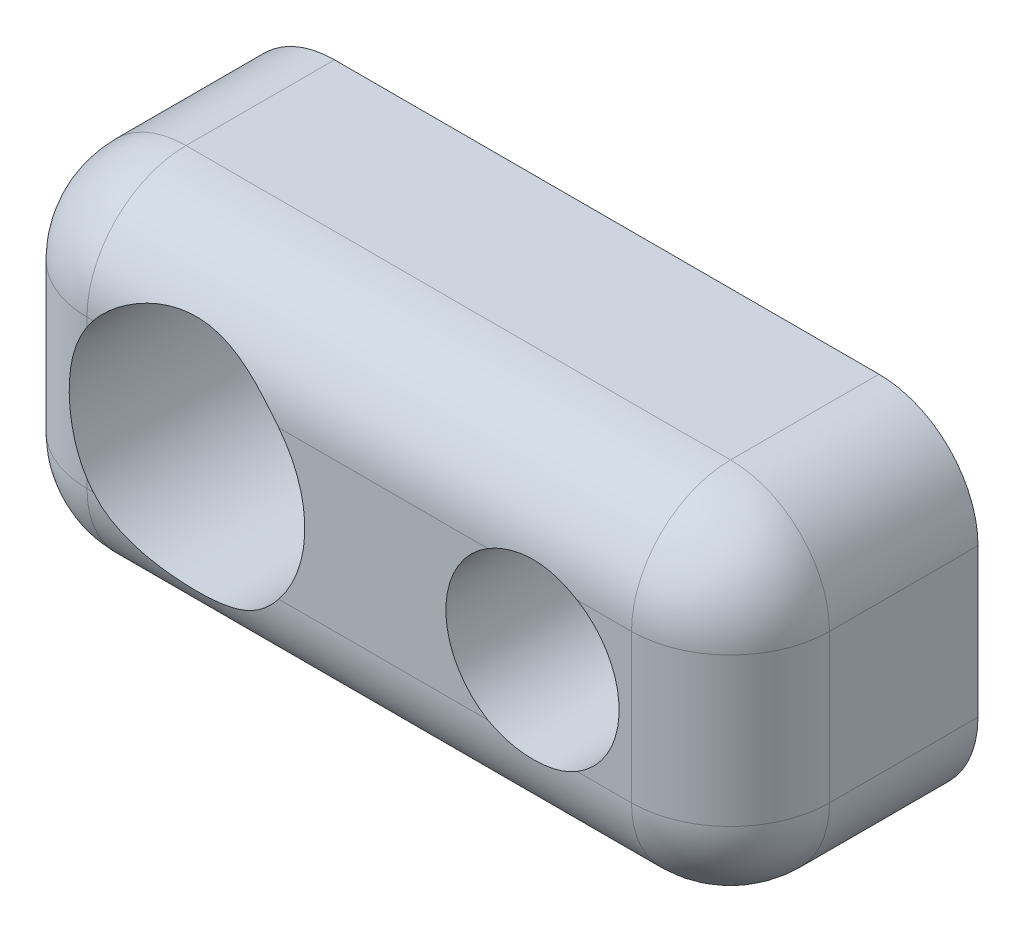
ISO-10303-21;
HEADER;
FILE_DESCRIPTION(('STEP AP214'),'2;1');
FILE_NAME('part.step','',(''),(''),'','','');
FILE_SCHEMA(('AUTOMOTIVE_DESIGN { 1 0 10303 214 1 1 1 1 }'));
ENDSEC;
DATA;
#1=APPLICATION_CONTEXT('core data for automotive mechanical design processes');
#2=APPLICATION_PROTOCOL_DEFINITION('international standard','automotive_design',2000,#1);
#3=PRODUCT_CONTEXT('',#1,'mechanical');
#4=PRODUCT('Part','Part','',(#3));
#5=PRODUCT_RELATED_PRODUCT_CATEGORY('part','',(#4));
#6=PRODUCT_DEFINITION_FORMATION('','',#4);
#7=PRODUCT_DEFINITION_CONTEXT('part definition',#1,'design');
#8=PRODUCT_DEFINITION('design','',#6,#7);
#9=PRODUCT_DEFINITION_SHAPE('','',#8);
#10=(LENGTH_UNIT() NAMED_UNIT(*) SI_UNIT(.MILLI.,.METRE.));
#11=(NAMED_UNIT(*) PLANE_ANGLE_UNIT() SI_UNIT($,.RADIAN.));
#12=(NAMED_UNIT(*) SI_UNIT($,.STERADIAN.) SOLID_ANGLE_UNIT());
#13=UNCERTAINTY_MEASURE_WITH_UNIT(LENGTH_MEASURE(1.E-05),#10,'distance_accuracy_value','');
#14=(GEOMETRIC_REPRESENTATION_CONTEXT(3) GLOBAL_UNCERTAINTY_ASSIGNED_CONTEXT((#13)) GLOBAL_UNIT_ASSIGNED_CONTEXT((#10,
#11,#12)) REPRESENTATION_CONTEXT('',''));
#15=CARTESIAN_POINT('',(0.,0.,0.));
#16=DIRECTION('',(0.,0.,1.));
#17=DIRECTION('',(1.,0.,0.));
#18=AXIS2_PLACEMENT_3D('',#15,#16,#17);
#19=CARTESIAN_POINT('',(5.5,1.5,5.));
#20=DIRECTION('',(0.,0.,-1.));
#21=DIRECTION('',(-1.,0.,0.));
#22=AXIS2_PLACEMENT_3D('',#19,#20,#21);
#23=PLANE('',#22);
#24=CARTESIAN_POINT('',(-3.5,0.,5.));
#25=DIRECTION('',(0.,0.,1.));
#26=DIRECTION('',(1.,0.,0.));
#27=AXIS2_PLACEMENT_3D('',#24,#25,#26);
#28=CIRCLE('',#27,2.4);
#29=CARTESIAN_POINT('',(-1.62650060048048,-1.5,5.));
#30=VERTEX_POINT('',#29);
#31=CARTESIAN_POINT('',(-1.62650060048048,1.5,5.));
#32=VERTEX_POINT('',#31);
#33=EDGE_CURVE('E177',#30,#32,#28,.T.);
#34=ORIENTED_EDGE('',*,*,#33,.F.);
#35=DIRECTION('',(1.,0.,0.));
#36=VECTOR('',#35,1.);
#37=CARTESIAN_POINT('',(5.5,-1.5,5.));
#38=LINE('',#37,#36);
#39=CARTESIAN_POINT('',(2.59861218113401,-1.5,5.));
#40=VERTEX_POINT('',#39);
#41=EDGE_CURVE('E226',#30,#40,#38,.T.);
#42=ORIENTED_EDGE('',*,*,#41,.T.);
#43=CARTESIAN_POINT('',(3.5,0.,5.));
#44=DIRECTION('',(0.,0.,1.));
#45=DIRECTION('',(1.,0.,0.));
#46=AXIS2_PLACEMENT_3D('',#43,#44,#45);
#47=CIRCLE('',#46,1.75);
#48=CARTESIAN_POINT('',(2.598612181134,1.5,5.));
#49=VERTEX_POINT('',#48);
#50=EDGE_CURVE('E358',#49,#40,#47,.T.);
#51=ORIENTED_EDGE('',*,*,#50,.F.);
#52=DIRECTION('',(-1.,0.,0.));
#53=VECTOR('',#52,1.);
#54=CARTESIAN_POINT('',(5.5,1.5,5.));
#55=LINE('',#54,#53);
#56=EDGE_CURVE('E213',#49,#32,#55,.T.);
#57=ORIENTED_EDGE('',*,*,#56,.T.);
#58=EDGE_LOOP('',(#34,#42,#51,#57));
#59=FACE_BOUND('',#58,.T.);
#60=ADVANCED_FACE('F37',(#59),#23,.F.);
#61=DIRECTION('',(0.,-1.,0.));
#62=VECTOR('',#61,1.);
#63=CARTESIAN_POINT('',(-5.5,1.5,5.));
#64=LINE('',#63,#62);
#65=CARTESIAN_POINT('',(-5.5,-1.32664991614216,5.));
#66=VERTEX_POINT('',#65);
#67=CARTESIAN_POINT('',(-5.5,-1.5,5.));
#68=VERTEX_POINT('',#67);
#69=EDGE_CURVE('E222',#66,#68,#64,.T.);
#70=ORIENTED_EDGE('',*,*,#69,.T.);
#71=DIRECTION('',(1.,0.,0.));
#72=VECTOR('',#71,1.);
#73=CARTESIAN_POINT('',(5.5,-1.5,5.));
#74=LINE('',#73,#72);
#75=CARTESIAN_POINT('',(-5.37349939951952,-1.5,5.));
#76=VERTEX_POINT('',#75);
#77=EDGE_CURVE('E224',#68,#76,#74,.T.);
#78=ORIENTED_EDGE('',*,*,#77,.T.);
#79=EDGE_CURVE('E175',#66,#76,#28,.T.);
#80=ORIENTED_EDGE('',*,*,#79,.F.);
#81=EDGE_LOOP('',(#70,#78,#80));
#82=FACE_BOUND('',#81,.T.);
#83=ADVANCED_FACE('F296',(#82),#23,.F.);
#84=CARTESIAN_POINT('',(4.401387818866,-1.5,5.));
#85=VERTEX_POINT('',#84);
#86=CARTESIAN_POINT('',(4.401387818866,1.5,5.));
#87=VERTEX_POINT('',#86);
#88=EDGE_CURVE('E354',#85,#87,#47,.T.);
#89=ORIENTED_EDGE('',*,*,#88,.F.);
#90=DIRECTION('',(1.,0.,0.));
#91=VECTOR('',#90,1.);
#92=CARTESIAN_POINT('',(5.5,-1.5,5.));
#93=LINE('',#92,#91);
#94=CARTESIAN_POINT('',(5.5,-1.5,5.));
#95=VERTEX_POINT('',#94);
#96=EDGE_CURVE('E220',#85,#95,#93,.T.);
#97=ORIENTED_EDGE('',*,*,#96,.T.);
#98=DIRECTION('',(0.,1.,0.));
#99=VECTOR('',#98,1.);
#100=CARTESIAN_POINT('',(5.5,1.5,5.));
#101=LINE('',#100,#99);
#102=CARTESIAN_POINT('',(5.5,1.5,5.));
#103=VERTEX_POINT('',#102);
#104=EDGE_CURVE('E217',#95,#103,#101,.T.);
#105=ORIENTED_EDGE('',*,*,#104,.T.);
#106=DIRECTION('',(-1.,0.,0.));
#107=VECTOR('',#106,1.);
#108=CARTESIAN_POINT('',(5.5,1.5,5.));
#109=LINE('',#108,#107);
#110=EDGE_CURVE('E215',#103,#87,#109,.T.);
#111=ORIENTED_EDGE('',*,*,#110,.T.);
#112=EDGE_LOOP('',(#89,#97,#105,#111));
#113=FACE_BOUND('',#112,.T.);
#114=ADVANCED_FACE('F302',(#113),#23,.F.);
#115=DIRECTION('',(-1.,0.,0.));
#116=VECTOR('',#115,1.);
#117=CARTESIAN_POINT('',(5.5,1.5,5.));
#118=LINE('',#117,#116);
#119=CARTESIAN_POINT('',(-5.37349939951952,1.5,5.));
#120=VERTEX_POINT('',#119);
#121=CARTESIAN_POINT('',(-5.5,1.5,5.));
#122=VERTEX_POINT('',#121);
#123=EDGE_CURVE('E209',#120,#122,#118,.T.);
#124=ORIENTED_EDGE('',*,*,#123,.T.);
#125=DIRECTION('',(0.,-1.,0.));
#126=VECTOR('',#125,1.);
#127=CARTESIAN_POINT('',(-5.5,1.5,5.));
#128=LINE('',#127,#126);
#129=CARTESIAN_POINT('',(-5.5,1.32664991614216,5.));
#130=VERTEX_POINT('',#129);
#131=EDGE_CURVE('E211',#122,#130,#128,.T.);
#132=ORIENTED_EDGE('',*,*,#131,.T.);
#133=EDGE_CURVE('E172',#120,#130,#28,.T.);
#134=ORIENTED_EDGE('',*,*,#133,.F.);
#135=EDGE_LOOP('',(#124,#132,#134));
#136=FACE_BOUND('',#135,.T.);
#137=ADVANCED_FACE('F298',(#136),#23,.F.);
#138=CARTESIAN_POINT('',(5.5,1.5,0.));
#139=DIRECTION('',(0.,0.,-1.));
#140=DIRECTION('',(-1.,0.,0.));
#141=AXIS2_PLACEMENT_3D('',#138,#139,#140);
#142=PLANE('',#141);
#143=CARTESIAN_POINT('',(-3.5,0.,0.));
#144=DIRECTION('',(0.,0.,1.));
#145=DIRECTION('',(1.,0.,0.));
#146=AXIS2_PLACEMENT_3D('',#143,#144,#145);
#147=CIRCLE('',#146,2.4);
#148=CARTESIAN_POINT('',(-1.1,0.,0.));
#149=VERTEX_POINT('',#148);
#150=EDGE_CURVE('E179',#149,#149,#147,.T.);
#151=ORIENTED_EDGE('',*,*,#150,.T.);
#152=EDGE_LOOP('',(#151));
#153=FACE_BOUND('',#152,.T.);
#154=CARTESIAN_POINT('',(5.5,1.5,0.));
#155=DIRECTION('',(0.,0.,1.));
#156=DIRECTION('',(-1.,0.,0.));
#157=AXIS2_PLACEMENT_3D('',#154,#155,#156);
#158=CIRCLE('',#157,2.);
#159=CARTESIAN_POINT('',(7.5,1.5,0.));
#160=VERTEX_POINT('',#159);
#161=CARTESIAN_POINT('',(5.5,3.5,0.));
#162=VERTEX_POINT('',#161);
#163=EDGE_CURVE('E163',#160,#162,#158,.T.);
#164=ORIENTED_EDGE('',*,*,#163,.F.);
#165=DIRECTION('',(0.,1.,0.));
#166=VECTOR('',#165,1.);
#167=CARTESIAN_POINT('',(7.5,1.5,0.));
#168=LINE('',#167,#166);
#169=CARTESIAN_POINT('',(7.5,-1.5,0.));
#170=VERTEX_POINT('',#169);
#171=EDGE_CURVE('E194',#170,#160,#168,.T.);
#172=ORIENTED_EDGE('',*,*,#171,.F.);
#173=CARTESIAN_POINT('',(5.5,-1.5,0.));
#174=DIRECTION('',(0.,0.,1.));
#175=DIRECTION('',(1.,0.,0.));
#176=AXIS2_PLACEMENT_3D('',#173,#174,#175);
#177=CIRCLE('',#176,2.);
#178=CARTESIAN_POINT('',(5.5,-3.5,0.));
#179=VERTEX_POINT('',#178);
#180=EDGE_CURVE('E191',#179,#170,#177,.T.);
#181=ORIENTED_EDGE('',*,*,#180,.F.);
#182=DIRECTION('',(1.,0.,0.));
#183=VECTOR('',#182,1.);
#184=CARTESIAN_POINT('',(-5.5,-3.5,0.));
#185=LINE('',#184,#183);
#186=CARTESIAN_POINT('',(-5.5,-3.5,0.));
#187=VERTEX_POINT('',#186);
#188=EDGE_CURVE('E188',#187,#179,#185,.T.);
#189=ORIENTED_EDGE('',*,*,#188,.F.);
#190=CARTESIAN_POINT('',(-5.5,-1.5,0.));
#191=DIRECTION('',(0.,0.,1.));
#192=DIRECTION('',(1.,0.,0.));
#193=AXIS2_PLACEMENT_3D('',#190,#191,#192);
#194=CIRCLE('',#193,2.);
#195=CARTESIAN_POINT('',(-7.5,-1.5,0.));
#196=VERTEX_POINT('',#195);
#197=EDGE_CURVE('E185',#196,#187,#194,.T.);
#198=ORIENTED_EDGE('',*,*,#197,.F.);
#199=DIRECTION('',(0.,-1.,0.));
#200=VECTOR('',#199,1.);
#201=CARTESIAN_POINT('',(-7.5,1.5,0.));
#202=LINE('',#201,#200);
#203=CARTESIAN_POINT('',(-7.5,1.5,0.));
#204=VERTEX_POINT('',#203);
#205=EDGE_CURVE('E182',#204,#196,#202,.T.);
#206=ORIENTED_EDGE('',*,*,#205,.F.);
#207=CARTESIAN_POINT('',(-5.5,1.5,0.));
#208=DIRECTION('',(0.,0.,1.));
#209=DIRECTION('',(1.,0.,0.));
#210=AXIS2_PLACEMENT_3D('',#207,#208,#209);
#211=CIRCLE('',#210,2.);
#212=CARTESIAN_POINT('',(-5.5,3.5,0.));
#213=VERTEX_POINT('',#212);
#214=EDGE_CURVE('E166',#213,#204,#211,.T.);
#215=ORIENTED_EDGE('',*,*,#214,.F.);
#216=DIRECTION('',(-1.,0.,0.));
#217=VECTOR('',#216,1.);
#218=CARTESIAN_POINT('',(-5.5,3.5,0.));
#219=LINE('',#218,#217);
#220=EDGE_CURVE('E148',#162,#213,#219,.T.);
#221=ORIENTED_EDGE('',*,*,#220,.F.);
#222=EDGE_LOOP('',(#164,#172,#181,#189,#198,#206,#215,#221));
#223=FACE_BOUND('',#222,.T.);
#224=CARTESIAN_POINT('',(3.5,0.,0.));
#225=DIRECTION('',(0.,0.,1.));
#226=DIRECTION('',(1.,0.,0.));
#227=AXIS2_PLACEMENT_3D('',#224,#225,#226);
#228=CIRCLE('',#227,1.75);
#229=CARTESIAN_POINT('',(5.25,0.,0.));
#230=VERTEX_POINT('',#229);
#231=EDGE_CURVE('E349',#230,#230,#228,.T.);
#232=ORIENTED_EDGE('',*,*,#231,.T.);
#233=EDGE_LOOP('',(#232));
#234=FACE_BOUND('',#233,.T.);
#235=ADVANCED_FACE('F160',(#153,#223,#234),#142,.T.);
#236=CARTESIAN_POINT('',(5.5,1.5,5.));
#237=DIRECTION('',(0.,0.,-1.));
#238=DIRECTION('',(-1.,0.,0.));
#239=AXIS2_PLACEMENT_3D('',#236,#237,#238);
#240=CYLINDRICAL_SURFACE('',#239,2.);
#241=DIRECTION('',(0.,0.,-1.));
#242=VECTOR('',#241,1.);
#243=CARTESIAN_POINT('',(5.5,3.5,5.));
#244=LINE('',#243,#242);
#245=CARTESIAN_POINT('',(5.5,3.5,3.));
#246=VERTEX_POINT('',#245);
#247=EDGE_CURVE('E145',#246,#162,#244,.T.);
#248=ORIENTED_EDGE('',*,*,#247,.F.);
#249=CARTESIAN_POINT('',(5.5,1.5,3.));
#250=DIRECTION('',(0.,0.,-1.));
#251=DIRECTION('',(-1.,0.,0.));
#252=AXIS2_PLACEMENT_3D('',#249,#250,#251);
#253=CIRCLE('',#252,2.);
#254=CARTESIAN_POINT('',(7.5,1.5,3.));
#255=VERTEX_POINT('',#254);
#256=EDGE_CURVE('E155',#246,#255,#253,.T.);
#257=ORIENTED_EDGE('',*,*,#256,.T.);
#258=DIRECTION('',(0.,0.,-1.));
#259=VECTOR('',#258,1.);
#260=CARTESIAN_POINT('',(7.5,1.5,5.));
#261=LINE('',#260,#259);
#262=EDGE_CURVE('E170',#255,#160,#261,.T.);
#263=ORIENTED_EDGE('',*,*,#262,.T.);
#264=ORIENTED_EDGE('',*,*,#163,.T.);
#265=EDGE_LOOP('',(#248,#257,#263,#264));
#266=FACE_BOUND('',#265,.T.);
#267=ADVANCED_FACE('F168',(#266),#240,.T.);
#268=CARTESIAN_POINT('',(-5.5,3.5,5.));
#269=DIRECTION('',(0.,-1.,0.));
#270=DIRECTION('',(0.,0.,-1.));
#271=AXIS2_PLACEMENT_3D('',#268,#269,#270);
#272=PLANE('',#271);
#273=DIRECTION('',(0.,0.,-1.));
#274=VECTOR('',#273,1.);
#275=CARTESIAN_POINT('',(-5.5,3.5,5.));
#276=LINE('',#275,#274);
#277=CARTESIAN_POINT('',(-5.5,3.5,3.));
#278=VERTEX_POINT('',#277);
#279=EDGE_CURVE('E156',#278,#213,#276,.T.);
#280=ORIENTED_EDGE('',*,*,#279,.F.);
#281=DIRECTION('',(-1.,0.,0.));
#282=VECTOR('',#281,1.);
#283=CARTESIAN_POINT('',(-5.5,3.5,3.));
#284=LINE('',#283,#282);
#285=EDGE_CURVE('E11',#278,#246,#284,.F.);
#286=ORIENTED_EDGE('',*,*,#285,.T.);
#287=ORIENTED_EDGE('',*,*,#247,.T.);
#288=ORIENTED_EDGE('',*,*,#220,.T.);
#289=EDGE_LOOP('',(#280,#286,#287,#288));
#290=FACE_BOUND('',#289,.T.);
#291=ADVANCED_FACE('F147',(#290),#272,.F.);
#292=CARTESIAN_POINT('',(-5.5,1.5,5.));
#293=DIRECTION('',(0.,0.,-1.));
#294=DIRECTION('',(-1.,0.,0.));
#295=AXIS2_PLACEMENT_3D('',#292,#293,#294);
#296=CYLINDRICAL_SURFACE('',#295,2.);
#297=DIRECTION('',(0.,0.,-1.));
#298=VECTOR('',#297,1.);
#299=CARTESIAN_POINT('',(-7.5,1.5,5.));
#300=LINE('',#299,#298);
#301=CARTESIAN_POINT('',(-7.5,1.5,3.));
#302=VERTEX_POINT('',#301);
#303=EDGE_CURVE('E205',#302,#204,#300,.T.);
#304=ORIENTED_EDGE('',*,*,#303,.F.);
#305=CARTESIAN_POINT('',(-5.5,1.5,3.));
#306=DIRECTION('',(0.,0.,-1.));
#307=DIRECTION('',(-1.,0.,0.));
#308=AXIS2_PLACEMENT_3D('',#305,#306,#307);
#309=CIRCLE('',#308,2.);
#310=EDGE_CURVE('E46',#302,#278,#309,.T.);
#311=ORIENTED_EDGE('',*,*,#310,.T.);
#312=ORIENTED_EDGE('',*,*,#279,.T.);
#313=ORIENTED_EDGE('',*,*,#214,.T.);
#314=EDGE_LOOP('',(#304,#311,#312,#313));
#315=FACE_BOUND('',#314,.T.);
#316=ADVANCED_FACE('F414',(#315),#296,.T.);
#317=CARTESIAN_POINT('',(-7.5,1.5,5.));
#318=DIRECTION('',(1.,0.,0.));
#319=DIRECTION('',(0.,0.,-1.));
#320=AXIS2_PLACEMENT_3D('',#317,#318,#319);
#321=PLANE('',#320);
#322=DIRECTION('',(0.,0.,-1.));
#323=VECTOR('',#322,1.);
#324=CARTESIAN_POINT('',(-7.5,-1.5,5.));
#325=LINE('',#324,#323);
#326=CARTESIAN_POINT('',(-7.5,-1.5,3.));
#327=VERTEX_POINT('',#326);
#328=EDGE_CURVE('E203',#327,#196,#325,.T.);
#329=ORIENTED_EDGE('',*,*,#328,.F.);
#330=DIRECTION('',(0.,-1.,0.));
#331=VECTOR('',#330,1.);
#332=CARTESIAN_POINT('',(-7.5,1.5,3.));
#333=LINE('',#332,#331);
#334=EDGE_CURVE('E61',#327,#302,#333,.F.);
#335=ORIENTED_EDGE('',*,*,#334,.T.);
#336=ORIENTED_EDGE('',*,*,#303,.T.);
#337=ORIENTED_EDGE('',*,*,#205,.T.);
#338=EDGE_LOOP('',(#329,#335,#336,#337));
#339=FACE_BOUND('',#338,.T.);
#340=ADVANCED_FACE('F410',(#339),#321,.F.);
#341=CARTESIAN_POINT('',(-5.5,-1.5,5.));
#342=DIRECTION('',(0.,0.,-1.));
#343=DIRECTION('',(-1.,0.,0.));
#344=AXIS2_PLACEMENT_3D('',#341,#342,#343);
#345=CYLINDRICAL_SURFACE('',#344,2.);
#346=DIRECTION('',(0.,0.,-1.));
#347=VECTOR('',#346,1.);
#348=CARTESIAN_POINT('',(-5.5,-3.5,5.));
#349=LINE('',#348,#347);
#350=CARTESIAN_POINT('',(-5.5,-3.5,3.));
#351=VERTEX_POINT('',#350);
#352=EDGE_CURVE('E201',#351,#187,#349,.T.);
#353=ORIENTED_EDGE('',*,*,#352,.F.);
#354=CARTESIAN_POINT('',(-5.5,-1.5,3.));
#355=DIRECTION('',(0.,0.,-1.));
#356=DIRECTION('',(-1.,0.,0.));
#357=AXIS2_PLACEMENT_3D('',#354,#355,#356);
#358=CIRCLE('',#357,2.);
#359=EDGE_CURVE('E373',#351,#327,#358,.T.);
#360=ORIENTED_EDGE('',*,*,#359,.T.);
#361=ORIENTED_EDGE('',*,*,#328,.T.);
#362=ORIENTED_EDGE('',*,*,#197,.T.);
#363=EDGE_LOOP('',(#353,#360,#361,#362));
#364=FACE_BOUND('',#363,.T.);
#365=ADVANCED_FACE('F407',(#364),#345,.T.);
#366=CARTESIAN_POINT('',(-5.5,-3.5,5.));
#367=DIRECTION('',(0.,1.,0.));
#368=DIRECTION('',(0.,0.,1.));
#369=AXIS2_PLACEMENT_3D('',#366,#367,#368);
#370=PLANE('',#369);
#371=DIRECTION('',(0.,0.,-1.));
#372=VECTOR('',#371,1.);
#373=CARTESIAN_POINT('',(5.5,-3.5,5.));
#374=LINE('',#373,#372);
#375=CARTESIAN_POINT('',(5.5,-3.5,3.));
#376=VERTEX_POINT('',#375);
#377=EDGE_CURVE('E199',#376,#179,#374,.T.);
#378=ORIENTED_EDGE('',*,*,#377,.F.);
#379=DIRECTION('',(1.,0.,0.));
#380=VECTOR('',#379,1.);
#381=CARTESIAN_POINT('',(-5.5,-3.5,3.));
#382=LINE('',#381,#380);
#383=EDGE_CURVE('E372',#376,#351,#382,.F.);
#384=ORIENTED_EDGE('',*,*,#383,.T.);
#385=ORIENTED_EDGE('',*,*,#352,.T.);
#386=ORIENTED_EDGE('',*,*,#188,.T.);
#387=EDGE_LOOP('',(#378,#384,#385,#386));
#388=FACE_BOUND('',#387,.T.);
#389=ADVANCED_FACE('F393',(#388),#370,.F.);
#390=CARTESIAN_POINT('',(5.5,-1.5,5.));
#391=DIRECTION('',(0.,0.,-1.));
#392=DIRECTION('',(-1.,0.,0.));
#393=AXIS2_PLACEMENT_3D('',#390,#391,#392);
#394=CYLINDRICAL_SURFACE('',#393,2.);
#395=DIRECTION('',(0.,0.,-1.));
#396=VECTOR('',#395,1.);
#397=CARTESIAN_POINT('',(7.5,-1.5,5.));
#398=LINE('',#397,#396);
#399=CARTESIAN_POINT('',(7.5,-1.5,3.));
#400=VERTEX_POINT('',#399);
#401=EDGE_CURVE('E197',#400,#170,#398,.T.);
#402=ORIENTED_EDGE('',*,*,#401,.F.);
#403=CARTESIAN_POINT('',(5.5,-1.5,3.));
#404=DIRECTION('',(0.,0.,-1.));
#405=DIRECTION('',(-1.,0.,0.));
#406=AXIS2_PLACEMENT_3D('',#403,#404,#405);
#407=CIRCLE('',#406,2.);
#408=EDGE_CURVE('E230',#400,#376,#407,.T.);
#409=ORIENTED_EDGE('',*,*,#408,.T.);
#410=ORIENTED_EDGE('',*,*,#377,.T.);
#411=ORIENTED_EDGE('',*,*,#180,.T.);
#412=EDGE_LOOP('',(#402,#409,#410,#411));
#413=FACE_BOUND('',#412,.T.);
#414=ADVANCED_FACE('F392',(#413),#394,.T.);
#415=CARTESIAN_POINT('',(7.5,1.5,5.));
#416=DIRECTION('',(-1.,0.,0.));
#417=DIRECTION('',(0.,0.,1.));
#418=AXIS2_PLACEMENT_3D('',#415,#416,#417);
#419=PLANE('',#418);
#420=ORIENTED_EDGE('',*,*,#262,.F.);
#421=DIRECTION('',(0.,1.,0.));
#422=VECTOR('',#421,1.);
#423=CARTESIAN_POINT('',(7.5,1.5,3.));
#424=LINE('',#423,#422);
#425=EDGE_CURVE('E228',#255,#400,#424,.F.);
#426=ORIENTED_EDGE('',*,*,#425,.T.);
#427=ORIENTED_EDGE('',*,*,#401,.T.);
#428=ORIENTED_EDGE('',*,*,#171,.T.);
#429=EDGE_LOOP('',(#420,#426,#427,#428));
#430=FACE_BOUND('',#429,.T.);
#431=ADVANCED_FACE('F291',(#430),#419,.F.);
#432=CARTESIAN_POINT('',(-3.5,0.,5.));
#433=DIRECTION('',(0.,0.,-1.));
#434=DIRECTION('',(-1.,0.,0.));
#435=AXIS2_PLACEMENT_3D('',#432,#433,#434);
#436=CYLINDRICAL_SURFACE('',#435,2.4);
#437=ORIENTED_EDGE('',*,*,#79,.T.);
#438=CARTESIAN_POINT('',(-5.37349939951952,-1.5,5.));
#439=CARTESIAN_POINT('',(-5.33343702617075,-1.55004579475686,4.9999991491666));
#440=CARTESIAN_POINT('',(-5.29140409468391,-1.59842626919248,4.99812229102131));
#441=CARTESIAN_POINT('',(-5.20377699870844,-1.69151432920479,4.99135567665075));
#442=CARTESIAN_POINT('',(-5.15818734646524,-1.73622642548076,4.98646968538814));
#443=CARTESIAN_POINT('',(-5.01684233860221,-1.86421404099333,4.9684399807955));
#444=CARTESIAN_POINT('',(-4.91621080242777,-1.94171371962837,4.95191362995998));
#445=CARTESIAN_POINT('',(-4.70499757346677,-2.07938893076821,4.91555962410322));
#446=CARTESIAN_POINT('',(-4.59445518290554,-2.13962923607803,4.89574476499489));
#447=CARTESIAN_POINT('',(-4.36485167884853,-2.2422786316829,4.85796415691815));
#448=CARTESIAN_POINT('',(-4.24578391300375,-2.28467361588144,4.83999987920836));
#449=CARTESIAN_POINT('',(-4.05797978558066,-2.33523485728158,4.81734709720516));
#450=CARTESIAN_POINT('',(-3.99128126981334,-2.35017590869662,4.8103527341503));
#451=CARTESIAN_POINT('',(-3.85665745194877,-2.37433464053483,4.79881107032627));
#452=CARTESIAN_POINT('',(-3.78873271614737,-2.3835548967131,4.79426266840033));
#453=CARTESIAN_POINT('',(-3.65227396460133,-2.39614311823015,4.78800965130192));
#454=CARTESIAN_POINT('',(-3.58374058774429,-2.39951662519895,4.7863023433624));
#455=CARTESIAN_POINT('',(-3.44664790418437,-2.40038717991811,4.78586034865959));
#456=CARTESIAN_POINT('',(-3.37808860041186,-2.3978847628911,4.78712539115265));
#457=CARTESIAN_POINT('',(-3.18722834994626,-2.38269917449545,4.79471494596878));
#458=CARTESIAN_POINT('',(-3.0655082281537,-2.36350678677782,4.80426077638158));
#459=CARTESIAN_POINT('',(-2.82706149755491,-2.30699622145242,4.83021574647085));
#460=CARTESIAN_POINT('',(-2.71034266922647,-2.26965084325859,4.84663518046975));
#461=CARTESIAN_POINT('',(-2.47954179548476,-2.17596593371546,4.8830023691131));
#462=CARTESIAN_POINT('',(-2.3657773333292,-2.11889332005086,4.90306951260642));
#463=CARTESIAN_POINT('',(-2.14857898217028,-1.9873915735165,4.940904187224));
#464=CARTESIAN_POINT('',(-2.04512337785829,-1.91300007545,4.9586765766033));
#465=CARTESIAN_POINT('',(-1.88946879058377,-1.78102915119898,4.98079463886711));
#466=CARTESIAN_POINT('',(-1.83326564947673,-1.72855360315251,4.98766873648126));
#467=CARTESIAN_POINT('',(-1.72591736015525,-1.61820281026823,4.99727291959799));
#468=CARTESIAN_POINT('',(-1.67477869501471,-1.56032082407861,4.99999775610627));
#469=CARTESIAN_POINT('',(-1.62650060048048,-1.5,5.));
#470=B_SPLINE_CURVE_WITH_KNOTS('',3,(#438,#439,#440,#441,#442,#443,#444,#445,#446,#447,#448,
#449,#450,#451,#452,#453,#454,#455,#456,#457,#458,#459,#460,#461,#462,#463,#464,#465,#466,#467,
#468,#469),.UNSPECIFIED.,.F.,.F.,(4,2,2,2,2,2,2,2,2,2,2,2,2,2,2,4),(0.,0.192126135524436,
0.384012373945957,0.7663690535243,1.14727140353155,1.52847428054241,1.73435247153905,
1.94013789967252,2.14572817463787,2.35129972364688,2.72020477172649,3.08966430205334,
3.47466921630647,3.85884517861582,4.09001793744579,4.32148289754728),.UNSPECIFIED.);
#471=EDGE_CURVE('E270',#76,#30,#470,.T.);
#472=ORIENTED_EDGE('',*,*,#471,.T.);
#473=ORIENTED_EDGE('',*,*,#33,.T.);
#474=CARTESIAN_POINT('',(-1.62650060048048,1.5,5.));
#475=CARTESIAN_POINT('',(-1.66656297382925,1.55004579475686,4.9999991491666));
#476=CARTESIAN_POINT('',(-1.70859590531609,1.59842626919248,4.99812229102131));
#477=CARTESIAN_POINT('',(-1.79622300129157,1.69151432920479,4.99135567665075));
#478=CARTESIAN_POINT('',(-1.84181265353477,1.73622642548076,4.98646968538814));
#479=CARTESIAN_POINT('',(-1.98315766139779,1.86421404099333,4.9684399807955));
#480=CARTESIAN_POINT('',(-2.08378919757224,1.94171371962837,4.95191362995998));
#481=CARTESIAN_POINT('',(-2.29500242653323,2.07938893076821,4.91555962410322));
#482=CARTESIAN_POINT('',(-2.40554481709446,2.13962923607803,4.89574476499489));
#483=CARTESIAN_POINT('',(-2.63514832115147,2.2422786316829,4.85796415691815));
#484=CARTESIAN_POINT('',(-2.75421608699625,2.28467361588144,4.83999987920836));
#485=CARTESIAN_POINT('',(-2.94202021441934,2.33523485728158,4.81734709720516));
#486=CARTESIAN_POINT('',(-3.00871873018666,2.35017590869662,4.8103527341503));
#487=CARTESIAN_POINT('',(-3.14334254805123,2.37433464053483,4.79881107032627));
#488=CARTESIAN_POINT('',(-3.21126728385263,2.3835548967131,4.79426266840033));
#489=CARTESIAN_POINT('',(-3.34772603539867,2.39614311823015,4.78800965130192));
#490=CARTESIAN_POINT('',(-3.41625941225571,2.39951662519895,4.7863023433624));
#491=CARTESIAN_POINT('',(-3.55335209581563,2.40038717991811,4.78586034865959));
#492=CARTESIAN_POINT('',(-3.62191139958814,2.3978847628911,4.78712539115265));
#493=CARTESIAN_POINT('',(-3.81277165005374,2.38269917449545,4.79471494596878));
#494=CARTESIAN_POINT('',(-3.9344917718463,2.36350678677782,4.80426077638158));
#495=CARTESIAN_POINT('',(-4.17293850244509,2.30699622145242,4.83021574647085));
#496=CARTESIAN_POINT('',(-4.28965733077352,2.26965084325859,4.84663518046975));
#497=CARTESIAN_POINT('',(-4.52045820451524,2.17596593371546,4.8830023691131));
#498=CARTESIAN_POINT('',(-4.6342226666708,2.11889332005087,4.90306951260642));
#499=CARTESIAN_POINT('',(-4.85142101782972,1.9873915735165,4.940904187224));
#500=CARTESIAN_POINT('',(-4.95487662214171,1.91300007545,4.9586765766033));
#501=CARTESIAN_POINT('',(-5.11053120941623,1.78102915119898,4.98079463886711));
#502=CARTESIAN_POINT('',(-5.16673435052327,1.72855360315251,4.98766873648126));
#503=CARTESIAN_POINT('',(-5.27408263984475,1.61820281026823,4.99727291959799));
#504=CARTESIAN_POINT('',(-5.3252213049853,1.56032082407861,4.99999775610627));
#505=CARTESIAN_POINT('',(-5.37349939951952,1.5,5.));
#506=B_SPLINE_CURVE_WITH_KNOTS('',3,(#474,#475,#476,#477,#478,#479,#480,#481,#482,#483,#484,
#485,#486,#487,#488,#489,#490,#491,#492,#493,#494,#495,#496,#497,#498,#499,#500,#501,#502,#503,
#504,#505),.UNSPECIFIED.,.F.,.F.,(4,2,2,2,2,2,2,2,2,2,2,2,2,2,2,4),(0.,0.192126135524436,
0.384012373945956,0.7663690535243,1.14727140353155,1.52847428054241,1.73435247153905,
1.94013789967252,2.14572817463787,2.35129972364688,2.72020477172648,3.08966430205334,
3.47466921630646,3.85884517861582,4.09001793744579,4.32148289754728),.UNSPECIFIED.);
#507=EDGE_CURVE('E232',#32,#120,#506,.T.);
#508=ORIENTED_EDGE('',*,*,#507,.T.);
#509=ORIENTED_EDGE('',*,*,#133,.T.);
#510=CARTESIAN_POINT('',(-5.5,1.32664991614216,5.));
#511=CARTESIAN_POINT('',(-5.53712418132869,1.27069583012851,4.99998741915321));
#512=CARTESIAN_POINT('',(-5.57187845902924,1.21319146182202,4.99896596507632));
#513=CARTESIAN_POINT('',(-5.63642961920922,1.09551881103745,4.99560632032362));
#514=CARTESIAN_POINT('',(-5.66622784626259,1.03535125670736,4.99326848753797));
#515=CARTESIAN_POINT('',(-5.7206706349613,0.91275595688197,4.98797623805066));
#516=CARTESIAN_POINT('',(-5.7453150233962,0.850328135506215,4.98502180063279));
#517=CARTESIAN_POINT('',(-5.78929267919557,0.723626432943443,4.97909154360522));
#518=CARTESIAN_POINT('',(-5.80862571136087,0.659352470144167,4.97611572305462));
#519=CARTESIAN_POINT('',(-5.84184878674929,0.52938086519626,4.97064027743287));
#520=CARTESIAN_POINT('',(-5.85573795236437,0.463682995299012,4.96814072917513));
#521=CARTESIAN_POINT('',(-5.87796646411199,0.331328009304855,4.96399327555277));
#522=CARTESIAN_POINT('',(-5.88630588528349,0.264670906190339,4.96234535867319));
#523=CARTESIAN_POINT('',(-5.89736595557719,0.130909326779697,4.96013580068929));
#524=CARTESIAN_POINT('',(-5.90008964082737,0.063805111911817,4.95957357262155));
#525=CARTESIAN_POINT('',(-5.89990583981542,-0.0703918984110061,4.95961093843836));
#526=CARTESIAN_POINT('',(-5.89699851625417,-0.137484694139874,4.96021049875452));
#527=CARTESIAN_POINT('',(-5.8856244886284,-0.270580989890468,4.96248005986605));
#528=CARTESIAN_POINT('',(-5.87720758688806,-0.33658886845518,4.9641404682257));
#529=CARTESIAN_POINT('',(-5.8549362150932,-0.467659256243314,4.96828441336878));
#530=CARTESIAN_POINT('',(-5.84107935942501,-0.532721337702014,4.97076831120727));
#531=CARTESIAN_POINT('',(-5.79148197625258,-0.725740091873554,4.97893832724895));
#532=CARTESIAN_POINT('',(-5.7476968661479,-0.851735042129453,4.98534816452172));
#533=CARTESIAN_POINT('',(-5.66655426815955,-1.03469792013562,4.99323717728685));
#534=CARTESIAN_POINT('',(-5.63666830848423,-1.09507559885357,4.99558932428189));
#535=CARTESIAN_POINT('',(-5.57197748532011,-1.21301899100189,4.99896533821956));
#536=CARTESIAN_POINT('',(-5.53718229911612,-1.27058994373727,4.99999177897158));
#537=CARTESIAN_POINT('',(-5.5,-1.32664991614216,5.));
#538=B_SPLINE_CURVE_WITH_KNOTS('',3,(#510,#511,#512,#513,#514,#515,#516,#517,#518,#519,#520,
#521,#522,#523,#524,#525,#526,#527,#528,#529,#530,#531,#532,#533,#534,#535,#536,#537),
.UNSPECIFIED.,.F.,.F.,(4,2,2,2,2,2,2,2,2,2,2,2,2,4),(0.,0.201356872348394,0.402659027257848,
0.603967946451534,0.805285778634308,1.00663605201517,1.20798360285225,1.40922226726544,
1.6104551172291,1.80989363990939,2.00941972136421,2.40785938050552,2.60988543502041,
2.81151867093171),.UNSPECIFIED.);
#539=EDGE_CURVE('E240',#130,#66,#538,.T.);
#540=ORIENTED_EDGE('',*,*,#539,.T.);
#541=EDGE_LOOP('',(#437,#472,#473,#508,#509,#540));
#542=FACE_BOUND('',#541,.T.);
#543=ORIENTED_EDGE('',*,*,#150,.F.);
#544=EDGE_LOOP('',(#543));
#545=FACE_BOUND('',#544,.T.);
#546=ADVANCED_FACE('F247',(#542,#545),#436,.F.);
#547=CARTESIAN_POINT('',(3.5,0.,5.));
#548=DIRECTION('',(0.,0.,-1.));
#549=DIRECTION('',(-1.,0.,0.));
#550=AXIS2_PLACEMENT_3D('',#547,#548,#549);
#551=CYLINDRICAL_SURFACE('',#550,1.75);
#552=ORIENTED_EDGE('',*,*,#50,.T.);
#553=CARTESIAN_POINT('',(2.59861218113401,-1.5,5.));
#554=CARTESIAN_POINT('',(2.64074057820146,-1.52532137253515,4.99999253400119));
#555=CARTESIAN_POINT('',(2.68393392779778,-1.54885605019304,4.99951886500704));
#556=CARTESIAN_POINT('',(2.77213304093891,-1.59220599885677,4.99799304873495));
#557=CARTESIAN_POINT('',(2.81713858643115,-1.61202171573209,4.99694097086246));
#558=CARTESIAN_POINT('',(2.9086178277008,-1.64777939560282,4.99461303530058));
#559=CARTESIAN_POINT('',(2.95509030588072,-1.66372448051483,4.99333735939742));
#560=CARTESIAN_POINT('',(3.04919882122926,-1.6916532713376,4.99084469647708));
#561=CARTESIAN_POINT('',(3.09683486110264,-1.70363696803893,4.98962770959634));
#562=CARTESIAN_POINT('',(3.24103805423898,-1.73350932253654,4.98642951811111));
#563=CARTESIAN_POINT('',(3.3389495162183,-1.74533844269917,4.98489930805759));
#564=CARTESIAN_POINT('',(3.53534824482135,-1.75240353616438,4.98401148980035));
#565=CARTESIAN_POINT('',(3.63383560037165,-1.7476368754609,4.98465422647629));
#566=CARTESIAN_POINT('',(3.82820926592109,-1.72173117319774,4.98771203069669));
#567=CARTESIAN_POINT('',(3.92410416134362,-1.70065551428524,4.9901202350945));
#568=CARTESIAN_POINT('',(4.11089690300772,-1.64281168116189,4.99510626760233));
#569=CARTESIAN_POINT('',(4.20180319847847,-1.60607102687343,4.99768379156941));
#570=CARTESIAN_POINT('',(4.32719715679928,-1.54275653616497,4.99963039026018));
#571=CARTESIAN_POINT('',(4.36470915563118,-1.52205333954314,4.99998831752296));
#572=CARTESIAN_POINT('',(4.401387818866,-1.5,5.));
#573=B_SPLINE_CURVE_WITH_KNOTS('',3,(#553,#554,#555,#556,#557,#558,#559,#560,#561,#562,#563,
#564,#565,#566,#567,#568,#569,#570,#571,#572),.UNSPECIFIED.,.F.,.F.,(4,2,2,2,2,2,2,2,2,4),(0.,
0.147400526038308,0.294783368792382,0.442046939744095,0.589310853051183,0.883682047103532,
1.17809996452833,1.47137937914745,1.76414567614098,1.89256483373933),.UNSPECIFIED.);
#574=EDGE_CURVE('E269',#40,#85,#573,.T.);
#575=ORIENTED_EDGE('',*,*,#574,.T.);
#576=ORIENTED_EDGE('',*,*,#88,.T.);
#577=CARTESIAN_POINT('',(4.401387818866,1.5,5.));
#578=CARTESIAN_POINT('',(4.35925942179855,1.52532137253515,4.99999253400119));
#579=CARTESIAN_POINT('',(4.31606607220223,1.54885605019304,4.99951886500704));
#580=CARTESIAN_POINT('',(4.2278669590611,1.59220599885677,4.99799304873495));
#581=CARTESIAN_POINT('',(4.18286141356886,1.61202171573209,4.99694097086246));
#582=CARTESIAN_POINT('',(4.09138217229921,1.64777939560282,4.99461303530058));
#583=CARTESIAN_POINT('',(4.04490969411929,1.66372448051483,4.99333735939742));
#584=CARTESIAN_POINT('',(3.95080117877075,1.6916532713376,4.99084469647708));
#585=CARTESIAN_POINT('',(3.90316513889737,1.70363696803893,4.98962770959634));
#586=CARTESIAN_POINT('',(3.75896194576102,1.73350932253654,4.98642951811111));
#587=CARTESIAN_POINT('',(3.66105048378171,1.74533844269917,4.98489930805759));
#588=CARTESIAN_POINT('',(3.46465175517866,1.75240353616438,4.98401148980035));
#589=CARTESIAN_POINT('',(3.36616439962836,1.74763687546091,4.98465422647629));
#590=CARTESIAN_POINT('',(3.17179073407892,1.72173117319774,4.98771203069669));
#591=CARTESIAN_POINT('',(3.07589583865639,1.70065551428524,4.9901202350945));
#592=CARTESIAN_POINT('',(2.88910309699229,1.6428116811619,4.99510626760233));
#593=CARTESIAN_POINT('',(2.79819680152153,1.60607102687344,4.99768379156941));
#594=CARTESIAN_POINT('',(2.67280284320072,1.54275653616497,4.99963039026018));
#595=CARTESIAN_POINT('',(2.63529084436882,1.52205333954314,4.99998831752296));
#596=CARTESIAN_POINT('',(2.598612181134,1.5,5.));
#597=B_SPLINE_CURVE_WITH_KNOTS('',3,(#577,#578,#579,#580,#581,#582,#583,#584,#585,#586,#587,
#588,#589,#590,#591,#592,#593,#594,#595,#596),.UNSPECIFIED.,.F.,.F.,(4,2,2,2,2,2,2,2,2,4),(0.,
0.147400526038308,0.294783368792382,0.442046939744094,0.589310853051183,0.883682047103532,
1.17809996452833,1.47137937914745,1.76414567614098,1.89256483373934),.UNSPECIFIED.);
#598=EDGE_CURVE('E263',#87,#49,#597,.T.);
#599=ORIENTED_EDGE('',*,*,#598,.T.);
#600=EDGE_LOOP('',(#552,#575,#576,#599));
#601=FACE_BOUND('',#600,.T.);
#602=ORIENTED_EDGE('',*,*,#231,.F.);
#603=EDGE_LOOP('',(#602));
#604=FACE_BOUND('',#603,.T.);
#605=ADVANCED_FACE('F280',(#601,#604),#551,.F.);
#606=CARTESIAN_POINT('',(-5.5,-1.5,3.));
#607=DIRECTION('',(0.,0.,-1.));
#608=DIRECTION('',(-1.,0.,0.));
#609=AXIS2_PLACEMENT_3D('',#606,#607,#608);
#610=SPHERICAL_SURFACE('',#609,2.);
#611=CARTESIAN_POINT('',(-5.5,-1.5,3.));
#612=DIRECTION('',(0.,1.,0.));
#613=DIRECTION('',(-1.,0.,0.));
#614=AXIS2_PLACEMENT_3D('',#611,#612,#613);
#615=CIRCLE('',#614,2.);
#616=EDGE_CURVE('E344',#327,#68,#615,.T.);
#617=ORIENTED_EDGE('',*,*,#616,.F.);
#618=ORIENTED_EDGE('',*,*,#359,.F.);
#619=CARTESIAN_POINT('',(-5.5,-1.5,3.));
#620=DIRECTION('',(1.,0.,0.));
#621=DIRECTION('',(0.,0.,-1.));
#622=AXIS2_PLACEMENT_3D('',#619,#620,#621);
#623=CIRCLE('',#622,2.);
#624=EDGE_CURVE('E41',#68,#351,#623,.T.);
#625=ORIENTED_EDGE('',*,*,#624,.F.);
#626=EDGE_LOOP('',(#617,#618,#625));
#627=FACE_BOUND('',#626,.T.);
#628=ADVANCED_FACE('F39',(#627),#610,.T.);
#629=CARTESIAN_POINT('',(5.5,-1.5,3.));
#630=DIRECTION('',(1.,0.,0.));
#631=DIRECTION('',(0.,0.,-1.));
#632=AXIS2_PLACEMENT_3D('',#629,#630,#631);
#633=CYLINDRICAL_SURFACE('',#632,2.);
#634=ORIENTED_EDGE('',*,*,#624,.T.);
#635=ORIENTED_EDGE('',*,*,#383,.F.);
#636=CARTESIAN_POINT('',(5.5,-1.5,3.));
#637=DIRECTION('',(1.,0.,0.));
#638=DIRECTION('',(0.,0.,-1.));
#639=AXIS2_PLACEMENT_3D('',#636,#637,#638);
#640=CIRCLE('',#639,2.);
#641=EDGE_CURVE('E330',#95,#376,#640,.T.);
#642=ORIENTED_EDGE('',*,*,#641,.F.);
#643=ORIENTED_EDGE('',*,*,#96,.F.);
#644=ORIENTED_EDGE('',*,*,#574,.F.);
#645=ORIENTED_EDGE('',*,*,#41,.F.);
#646=ORIENTED_EDGE('',*,*,#471,.F.);
#647=ORIENTED_EDGE('',*,*,#77,.F.);
#648=EDGE_LOOP('',(#634,#635,#642,#643,#644,#645,#646,#647));
#649=FACE_BOUND('',#648,.T.);
#650=ADVANCED_FACE('F289',(#649),#633,.T.);
#651=CARTESIAN_POINT('',(-5.5,1.5,3.));
#652=DIRECTION('',(0.,-1.,0.));
#653=DIRECTION('',(0.,0.,-1.));
#654=AXIS2_PLACEMENT_3D('',#651,#652,#653);
#655=CYLINDRICAL_SURFACE('',#654,2.);
#656=ORIENTED_EDGE('',*,*,#539,.F.);
#657=ORIENTED_EDGE('',*,*,#131,.F.);
#658=CARTESIAN_POINT('',(-5.5,1.5,3.));
#659=DIRECTION('',(0.,1.,0.));
#660=DIRECTION('',(0.,0.,1.));
#661=AXIS2_PLACEMENT_3D('',#658,#659,#660);
#662=CIRCLE('',#661,2.);
#663=EDGE_CURVE('E324',#302,#122,#662,.T.);
#664=ORIENTED_EDGE('',*,*,#663,.F.);
#665=ORIENTED_EDGE('',*,*,#334,.F.);
#666=ORIENTED_EDGE('',*,*,#616,.T.);
#667=ORIENTED_EDGE('',*,*,#69,.F.);
#668=EDGE_LOOP('',(#656,#657,#664,#665,#666,#667));
#669=FACE_BOUND('',#668,.T.);
#670=ADVANCED_FACE('F323',(#669),#655,.T.);
#671=CARTESIAN_POINT('',(5.5,-1.5,3.));
#672=DIRECTION('',(0.,0.,-1.));
#673=DIRECTION('',(-1.,0.,0.));
#674=AXIS2_PLACEMENT_3D('',#671,#672,#673);
#675=SPHERICAL_SURFACE('',#674,2.);
#676=ORIENTED_EDGE('',*,*,#641,.T.);
#677=ORIENTED_EDGE('',*,*,#408,.F.);
#678=CARTESIAN_POINT('',(5.5,-1.5,3.));
#679=DIRECTION('',(0.,1.,0.));
#680=DIRECTION('',(0.,0.,1.));
#681=AXIS2_PLACEMENT_3D('',#678,#679,#680);
#682=CIRCLE('',#681,2.);
#683=EDGE_CURVE('E331',#95,#400,#682,.T.);
#684=ORIENTED_EDGE('',*,*,#683,.F.);
#685=EDGE_LOOP('',(#676,#677,#684));
#686=FACE_BOUND('',#685,.T.);
#687=ADVANCED_FACE('F389',(#686),#675,.T.);
#688=CARTESIAN_POINT('',(-5.5,1.5,3.));
#689=DIRECTION('',(0.,0.,-1.));
#690=DIRECTION('',(-1.,0.,0.));
#691=AXIS2_PLACEMENT_3D('',#688,#689,#690);
#692=SPHERICAL_SURFACE('',#691,2.);
#693=ORIENTED_EDGE('',*,*,#310,.F.);
#694=ORIENTED_EDGE('',*,*,#663,.T.);
#695=CARTESIAN_POINT('',(-5.5,1.5,3.));
#696=DIRECTION('',(1.,0.,0.));
#697=DIRECTION('',(0.,0.,-1.));
#698=AXIS2_PLACEMENT_3D('',#695,#696,#697);
#699=CIRCLE('',#698,2.);
#700=EDGE_CURVE('E329',#278,#122,#699,.T.);
#701=ORIENTED_EDGE('',*,*,#700,.F.);
#702=EDGE_LOOP('',(#693,#694,#701));
#703=FACE_BOUND('',#702,.T.);
#704=ADVANCED_FACE('F328',(#703),#692,.T.);
#705=CARTESIAN_POINT('',(5.5,1.5,3.));
#706=DIRECTION('',(0.,1.,0.));
#707=DIRECTION('',(0.,0.,1.));
#708=AXIS2_PLACEMENT_3D('',#705,#706,#707);
#709=CYLINDRICAL_SURFACE('',#708,2.);
#710=ORIENTED_EDGE('',*,*,#683,.T.);
#711=ORIENTED_EDGE('',*,*,#425,.F.);
#712=CARTESIAN_POINT('',(5.5,1.5,3.));
#713=DIRECTION('',(0.,1.,0.));
#714=DIRECTION('',(-1.,0.,0.));
#715=AXIS2_PLACEMENT_3D('',#712,#713,#714);
#716=CIRCLE('',#715,2.);
#717=EDGE_CURVE('E335',#103,#255,#716,.T.);
#718=ORIENTED_EDGE('',*,*,#717,.F.);
#719=ORIENTED_EDGE('',*,*,#104,.F.);
#720=EDGE_LOOP('',(#710,#711,#718,#719));
#721=FACE_BOUND('',#720,.T.);
#722=ADVANCED_FACE('F257',(#721),#709,.T.);
#723=CARTESIAN_POINT('',(5.5,1.5,3.));
#724=DIRECTION('',(-1.,0.,0.));
#725=DIRECTION('',(0.,0.,1.));
#726=AXIS2_PLACEMENT_3D('',#723,#724,#725);
#727=CYLINDRICAL_SURFACE('',#726,2.);
#728=ORIENTED_EDGE('',*,*,#598,.F.);
#729=ORIENTED_EDGE('',*,*,#110,.F.);
#730=CARTESIAN_POINT('',(5.5,1.5,3.));
#731=DIRECTION('',(1.,0.,0.));
#732=DIRECTION('',(0.,0.,-1.));
#733=AXIS2_PLACEMENT_3D('',#730,#731,#732);
#734=CIRCLE('',#733,2.);
#735=EDGE_CURVE('E339',#246,#103,#734,.T.);
#736=ORIENTED_EDGE('',*,*,#735,.F.);
#737=ORIENTED_EDGE('',*,*,#285,.F.);
#738=ORIENTED_EDGE('',*,*,#700,.T.);
#739=ORIENTED_EDGE('',*,*,#123,.F.);
#740=ORIENTED_EDGE('',*,*,#507,.F.);
#741=ORIENTED_EDGE('',*,*,#56,.F.);
#742=EDGE_LOOP('',(#728,#729,#736,#737,#738,#739,#740,#741));
#743=FACE_BOUND('',#742,.T.);
#744=ADVANCED_FACE('F251',(#743),#727,.T.);
#745=CARTESIAN_POINT('',(5.5,1.5,3.));
#746=DIRECTION('',(0.,0.,-1.));
#747=DIRECTION('',(-1.,0.,0.));
#748=AXIS2_PLACEMENT_3D('',#745,#746,#747);
#749=SPHERICAL_SURFACE('',#748,2.);
#750=ORIENTED_EDGE('',*,*,#717,.T.);
#751=ORIENTED_EDGE('',*,*,#256,.F.);
#752=ORIENTED_EDGE('',*,*,#735,.T.);
#753=EDGE_LOOP('',(#750,#751,#752));
#754=FACE_BOUND('',#753,.T.);
#755=ADVANCED_FACE('F256',(#754),#749,.T.);
#756=CLOSED_SHELL('',(#60,#83,#114,#137,#235,#267,#291,#316,#340,#365,#389,#414,#431,#546,#605,
#628,#650,#670,#687,#704,#722,#744,#755));
#757=MANIFOLD_SOLID_BREP('B2',#756);
#758=ADVANCED_BREP_SHAPE_REPRESENTATION('',(#18,#757),#14);
#759=SHAPE_DEFINITION_REPRESENTATION(#9,#758);
ENDSEC;
END-ISO-10303-21;
